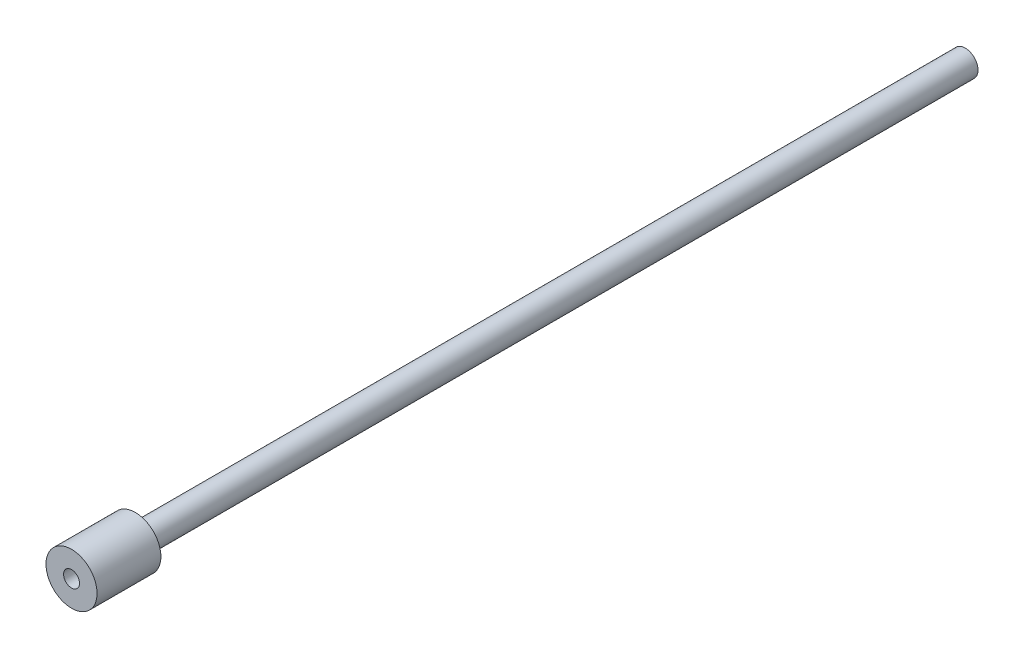
ISO-10303-21;
HEADER;
FILE_DESCRIPTION(('STEP AP214'),'2;1');
FILE_NAME('part.step','',(''),(''),'','','');
FILE_SCHEMA(('AUTOMOTIVE_DESIGN { 1 0 10303 214 1 1 1 1 }'));
ENDSEC;
DATA;
#1=APPLICATION_CONTEXT('core data for automotive mechanical design processes');
#2=APPLICATION_PROTOCOL_DEFINITION('international standard','automotive_design',2000,#1);
#3=PRODUCT_CONTEXT('',#1,'mechanical');
#4=PRODUCT('Part','Part','',(#3));
#5=PRODUCT_RELATED_PRODUCT_CATEGORY('part','',(#4));
#6=PRODUCT_DEFINITION_FORMATION('','',#4);
#7=PRODUCT_DEFINITION_CONTEXT('part definition',#1,'design');
#8=PRODUCT_DEFINITION('design','',#6,#7);
#9=PRODUCT_DEFINITION_SHAPE('','',#8);
#10=(LENGTH_UNIT() NAMED_UNIT(*) SI_UNIT(.MILLI.,.METRE.));
#11=(NAMED_UNIT(*) PLANE_ANGLE_UNIT() SI_UNIT($,.RADIAN.));
#12=(NAMED_UNIT(*) SI_UNIT($,.STERADIAN.) SOLID_ANGLE_UNIT());
#13=UNCERTAINTY_MEASURE_WITH_UNIT(LENGTH_MEASURE(1.E-05),#10,'distance_accuracy_value','');
#14=(GEOMETRIC_REPRESENTATION_CONTEXT(3) GLOBAL_UNCERTAINTY_ASSIGNED_CONTEXT((#13)) GLOBAL_UNIT_ASSIGNED_CONTEXT((#10,
#11,#12)) REPRESENTATION_CONTEXT('',''));
#15=CARTESIAN_POINT('',(0.,0.,0.));
#16=DIRECTION('',(0.,0.,1.));
#17=DIRECTION('',(1.,0.,0.));
#18=AXIS2_PLACEMENT_3D('',#15,#16,#17);
#19=CARTESIAN_POINT('',(0.,0.,-279.995833301183));
#20=DIRECTION('',(0.,0.,-1.));
#21=DIRECTION('',(-1.,0.,0.));
#22=AXIS2_PLACEMENT_3D('',#19,#20,#21);
#23=CYLINDRICAL_SURFACE('',#22,7.99999999999997);
#24=CARTESIAN_POINT('',(0.,0.,-20.));
#25=DIRECTION('',(0.,0.,-1.));
#26=DIRECTION('',(-1.,0.,0.));
#27=AXIS2_PLACEMENT_3D('',#24,#25,#26);
#28=CIRCLE('',#27,7.99999999999998);
#29=CARTESIAN_POINT('',(-7.99999999999994,0.,-20.));
#30=VERTEX_POINT('',#29);
#31=EDGE_CURVE('E10',#30,#30,#28,.T.);
#32=ORIENTED_EDGE('',*,*,#31,.F.);
#33=EDGE_LOOP('',(#32));
#34=FACE_BOUND('',#33,.T.);
#35=CARTESIAN_POINT('',(0.,0.,0.));
#36=DIRECTION('',(0.,0.,-1.));
#37=DIRECTION('',(-1.,0.,0.));
#38=AXIS2_PLACEMENT_3D('',#35,#36,#37);
#39=CIRCLE('',#38,7.99999999999997);
#40=CARTESIAN_POINT('',(-7.99999999999993,0.,0.));
#41=VERTEX_POINT('',#40);
#42=EDGE_CURVE('E57',#41,#41,#39,.T.);
#43=ORIENTED_EDGE('',*,*,#42,.T.);
#44=EDGE_LOOP('',(#43));
#45=FACE_BOUND('',#44,.T.);
#46=ADVANCED_FACE('F35',(#34,#45),#23,.T.);
#47=CARTESIAN_POINT('',(8.00000000000001,0.,-20.));
#48=DIRECTION('',(0.,0.,1.));
#49=DIRECTION('',(1.,0.,0.));
#50=AXIS2_PLACEMENT_3D('',#47,#48,#49);
#51=PLANE('',#50);
#52=CARTESIAN_POINT('',(0.,0.,-20.));
#53=DIRECTION('',(0.,0.,-1.));
#54=DIRECTION('',(-1.,0.,0.));
#55=AXIS2_PLACEMENT_3D('',#52,#53,#54);
#56=CIRCLE('',#55,4.);
#57=CARTESIAN_POINT('',(-3.99999999999997,0.,-20.));
#58=VERTEX_POINT('',#57);
#59=EDGE_CURVE('E41',#58,#58,#56,.T.);
#60=ORIENTED_EDGE('',*,*,#59,.F.);
#61=EDGE_LOOP('',(#60));
#62=FACE_BOUND('',#61,.T.);
#63=ORIENTED_EDGE('',*,*,#31,.T.);
#64=EDGE_LOOP('',(#63));
#65=FACE_BOUND('',#64,.T.);
#66=ADVANCED_FACE('F85',(#62,#65),#51,.F.);
#67=CARTESIAN_POINT('',(0.,0.,-279.995833301183));
#68=DIRECTION('',(0.,0.,-1.));
#69=DIRECTION('',(-1.,0.,0.));
#70=AXIS2_PLACEMENT_3D('',#67,#68,#69);
#71=CYLINDRICAL_SURFACE('',#70,4.00000000000003);
#72=CARTESIAN_POINT('',(0.,0.,-279.995833301183));
#73=DIRECTION('',(0.,0.,-1.));
#74=DIRECTION('',(-1.,0.,0.));
#75=AXIS2_PLACEMENT_3D('',#72,#73,#74);
#76=CIRCLE('',#75,4.00000000000006);
#77=CARTESIAN_POINT('',(-4.00000000000013,0.,-279.995833301183));
#78=VERTEX_POINT('',#77);
#79=EDGE_CURVE('E45',#78,#78,#76,.T.);
#80=ORIENTED_EDGE('',*,*,#79,.F.);
#81=EDGE_LOOP('',(#80));
#82=FACE_BOUND('',#81,.T.);
#83=ORIENTED_EDGE('',*,*,#59,.T.);
#84=EDGE_LOOP('',(#83));
#85=FACE_BOUND('',#84,.T.);
#86=ADVANCED_FACE('F81',(#82,#85),#71,.T.);
#87=CARTESIAN_POINT('',(4.,0.,-279.995833301183));
#88=DIRECTION('',(0.,0.,1.));
#89=DIRECTION('',(1.,0.,0.));
#90=AXIS2_PLACEMENT_3D('',#87,#88,#89);
#91=PLANE('',#90);
#92=ORIENTED_EDGE('',*,*,#79,.T.);
#93=EDGE_LOOP('',(#92));
#94=FACE_BOUND('',#93,.T.);
#95=ADVANCED_FACE('F76',(#94),#91,.F.);
#96=CARTESIAN_POINT('',(0.,0.,-10.));
#97=DIRECTION('',(0.,0.,-1.));
#98=DIRECTION('',(-1.,0.,0.));
#99=AXIS2_PLACEMENT_3D('',#96,#97,#98);
#100=PLANE('',#99);
#101=CARTESIAN_POINT('',(0.,0.,-10.));
#102=DIRECTION('',(0.,0.,-1.));
#103=DIRECTION('',(-1.,0.,0.));
#104=AXIS2_PLACEMENT_3D('',#101,#102,#103);
#105=CIRCLE('',#104,2.49999999999996);
#106=CARTESIAN_POINT('',(-2.49999999999993,0.,-10.));
#107=VERTEX_POINT('',#106);
#108=EDGE_CURVE('E49',#107,#107,#105,.T.);
#109=ORIENTED_EDGE('',*,*,#108,.F.);
#110=EDGE_LOOP('',(#109));
#111=FACE_BOUND('',#110,.T.);
#112=ADVANCED_FACE('F71',(#111),#100,.F.);
#113=CARTESIAN_POINT('',(0.,0.,-279.995833301183));
#114=DIRECTION('',(0.,0.,-1.));
#115=DIRECTION('',(-1.,0.,0.));
#116=AXIS2_PLACEMENT_3D('',#113,#114,#115);
#117=CYLINDRICAL_SURFACE('',#116,2.49999999999996);
#118=CARTESIAN_POINT('',(0.,0.,0.));
#119=DIRECTION('',(0.,0.,-1.));
#120=DIRECTION('',(-1.,0.,0.));
#121=AXIS2_PLACEMENT_3D('',#118,#119,#120);
#122=CIRCLE('',#121,2.49999999999996);
#123=CARTESIAN_POINT('',(-2.49999999999992,0.,0.));
#124=VERTEX_POINT('',#123);
#125=EDGE_CURVE('E54',#124,#124,#122,.T.);
#126=ORIENTED_EDGE('',*,*,#125,.F.);
#127=EDGE_LOOP('',(#126));
#128=FACE_BOUND('',#127,.T.);
#129=ORIENTED_EDGE('',*,*,#108,.T.);
#130=EDGE_LOOP('',(#129));
#131=FACE_BOUND('',#130,.T.);
#132=ADVANCED_FACE('F65',(#128,#131),#117,.F.);
#133=CARTESIAN_POINT('',(2.5,0.,0.));
#134=DIRECTION('',(0.,0.,-1.));
#135=DIRECTION('',(-1.,0.,0.));
#136=AXIS2_PLACEMENT_3D('',#133,#134,#135);
#137=PLANE('',#136);
#138=ORIENTED_EDGE('',*,*,#42,.F.);
#139=EDGE_LOOP('',(#138));
#140=FACE_BOUND('',#139,.T.);
#141=ORIENTED_EDGE('',*,*,#125,.T.);
#142=EDGE_LOOP('',(#141));
#143=FACE_BOUND('',#142,.T.);
#144=ADVANCED_FACE('F62',(#140,#143),#137,.F.);
#145=CLOSED_SHELL('',(#46,#66,#86,#95,#112,#132,#144));
#146=MANIFOLD_SOLID_BREP('B2',#145);
#147=ADVANCED_BREP_SHAPE_REPRESENTATION('',(#18,#146),#14);
#148=SHAPE_DEFINITION_REPRESENTATION(#9,#147);
ENDSEC;
END-ISO-10303-21;
